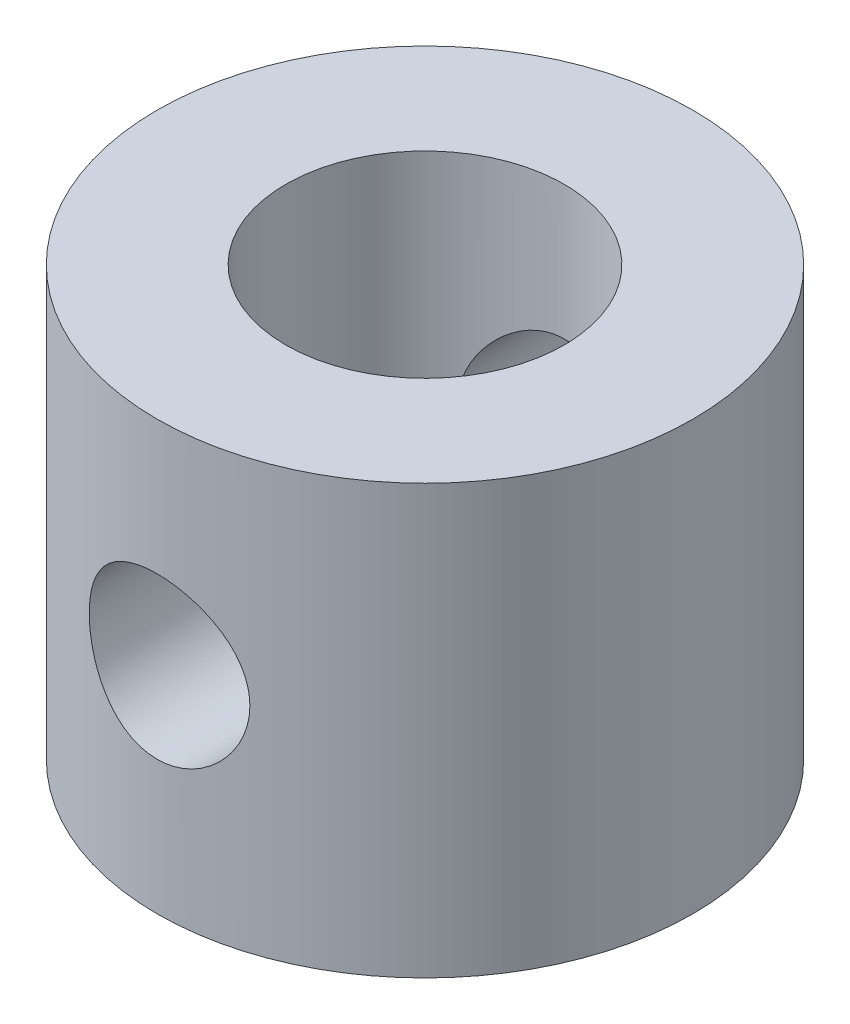
ISO-10303-21;
HEADER;
FILE_DESCRIPTION(('STEP AP214'),'2;1');
FILE_NAME('part.step','',(''),(''),'','','');
FILE_SCHEMA(('AUTOMOTIVE_DESIGN { 1 0 10303 214 1 1 1 1 }'));
ENDSEC;
DATA;
#1=APPLICATION_CONTEXT('core data for automotive mechanical design processes');
#2=APPLICATION_PROTOCOL_DEFINITION('international standard','automotive_design',2000,#1);
#3=PRODUCT_CONTEXT('',#1,'mechanical');
#4=PRODUCT('Part','Part','',(#3));
#5=PRODUCT_RELATED_PRODUCT_CATEGORY('part','',(#4));
#6=PRODUCT_DEFINITION_FORMATION('','',#4);
#7=PRODUCT_DEFINITION_CONTEXT('part definition',#1,'design');
#8=PRODUCT_DEFINITION('design','',#6,#7);
#9=PRODUCT_DEFINITION_SHAPE('','',#8);
#10=(LENGTH_UNIT() NAMED_UNIT(*) SI_UNIT(.MILLI.,.METRE.));
#11=(NAMED_UNIT(*) PLANE_ANGLE_UNIT() SI_UNIT($,.RADIAN.));
#12=(NAMED_UNIT(*) SI_UNIT($,.STERADIAN.) SOLID_ANGLE_UNIT());
#13=UNCERTAINTY_MEASURE_WITH_UNIT(LENGTH_MEASURE(1.E-05),#10,'distance_accuracy_value','');
#14=(GEOMETRIC_REPRESENTATION_CONTEXT(3) GLOBAL_UNCERTAINTY_ASSIGNED_CONTEXT((#13)) GLOBAL_UNIT_ASSIGNED_CONTEXT((#10,
#11,#12)) REPRESENTATION_CONTEXT('',''));
#15=CARTESIAN_POINT('',(0.,0.,0.));
#16=DIRECTION('',(0.,0.,1.));
#17=DIRECTION('',(1.,0.,0.));
#18=AXIS2_PLACEMENT_3D('',#15,#16,#17);
#19=CARTESIAN_POINT('',(0.,8.,0.));
#20=DIRECTION('',(0.,-1.,0.));
#21=DIRECTION('',(0.,0.,-1.));
#22=AXIS2_PLACEMENT_3D('',#19,#20,#21);
#23=CYLINDRICAL_SURFACE('',#22,5.);
#24=CARTESIAN_POINT('',(0.,5.5,-5.));
#25=CARTESIAN_POINT('',(-0.0822886127532999,5.49999900251511,-4.9999992925055));
#26=CARTESIAN_POINT('',(-0.164587318351529,5.49320613637603,-4.99794915693954));
#27=CARTESIAN_POINT('',(-0.326788125304881,5.4662786457779,-4.98997105593691));
#28=CARTESIAN_POINT('',(-0.40668950441142,5.44614004197666,-4.98404193389692));
#29=CARTESIAN_POINT('',(-0.561732707754526,5.39325398308974,-4.96895552501836));
#30=CARTESIAN_POINT('',(-0.636881364395373,5.36052513038106,-4.95980300250425));
#31=CARTESIAN_POINT('',(-0.780624181053131,5.28346390694416,-4.93922109237645));
#32=CARTESIAN_POINT('',(-0.849217467469669,5.23912999260458,-4.92779140192067));
#33=CARTESIAN_POINT('',(-0.979871797183745,5.13877599252733,-4.90350737192774));
#34=CARTESIAN_POINT('',(-1.04171807124434,5.08248337411409,-4.89062383657036));
#35=CARTESIAN_POINT('',(-1.15524920923324,4.96039077008982,-4.86505834210442));
#36=CARTESIAN_POINT('',(-1.20693236327441,4.89458918787504,-4.85237641724501));
#37=CARTESIAN_POINT('',(-1.29980037723708,4.75352924696239,-4.82834113993772));
#38=CARTESIAN_POINT('',(-1.34072309022213,4.67809153900926,-4.81702406663875));
#39=CARTESIAN_POINT('',(-1.4092139477476,4.52101074576971,-4.79743620394031));
#40=CARTESIAN_POINT('',(-1.43678529919973,4.43936915607202,-4.78916468313311));
#41=CARTESIAN_POINT('',(-1.47701633682652,4.27460973386954,-4.77690870838434));
#42=CARTESIAN_POINT('',(-1.49007196234677,4.19159725613606,-4.77281069324533));
#43=CARTESIAN_POINT('',(-1.50213730614672,4.02446684378323,-4.76902789749767));
#44=CARTESIAN_POINT('',(-1.50115042761078,3.94034918194091,-4.76934204760571));
#45=CARTESIAN_POINT('',(-1.48546977199812,3.77661609139152,-4.77424744067778));
#46=CARTESIAN_POINT('',(-1.47127205262685,3.69694774963776,-4.7786838859914));
#47=CARTESIAN_POINT('',(-1.43037420427056,3.54118021372654,-4.79108356228624));
#48=CARTESIAN_POINT('',(-1.40367284141641,3.46508137262567,-4.79904714132351));
#49=CARTESIAN_POINT('',(-1.33816026653682,3.31739965033926,-4.81772733074973));
#50=CARTESIAN_POINT('',(-1.29918816934643,3.24589291604474,-4.82848016115952));
#51=CARTESIAN_POINT('',(-1.21035222588683,3.11026797798981,-4.85150987000065));
#52=CARTESIAN_POINT('',(-1.16048574002588,3.04615157058622,-4.86378711746991));
#53=CARTESIAN_POINT('',(-1.04881290765546,2.92431380923798,-4.88911011297937));
#54=CARTESIAN_POINT('',(-0.986594907466972,2.86697133597033,-4.90216654310498));
#55=CARTESIAN_POINT('',(-0.853263259313967,2.76344601593575,-4.92712244063259));
#56=CARTESIAN_POINT('',(-0.782149051860888,2.71726387158557,-4.9390218351841));
#57=CARTESIAN_POINT('',(-0.632355038342803,2.63714007753527,-4.9604316006947));
#58=CARTESIAN_POINT('',(-0.553627749747951,2.60328248375014,-4.96992543668314));
#59=CARTESIAN_POINT('',(-0.39124541560352,2.54940040990037,-4.98533521832222));
#60=CARTESIAN_POINT('',(-0.307591751589582,2.52937207146751,-4.99125216186999));
#61=CARTESIAN_POINT('',(-0.140952242668332,2.50434782210061,-4.99868364643538));
#62=CARTESIAN_POINT('',(-0.0580500976011871,2.49883841419839,-5.0003485041779));
#63=CARTESIAN_POINT('',(0.107499605823383,2.50156915571208,-4.9995292324176));
#64=CARTESIAN_POINT('',(0.19014719669078,2.50980746965144,-4.99704565677756));
#65=CARTESIAN_POINT('',(0.350903605309697,2.5393846111115,-4.98830696987163));
#66=CARTESIAN_POINT('',(0.429072772614169,2.56042338758087,-4.98213829799417));
#67=CARTESIAN_POINT('',(0.580754638954522,2.6146432327782,-4.96674347841533));
#68=CARTESIAN_POINT('',(0.654266777025583,2.64782576103786,-4.95751696321085));
#69=CARTESIAN_POINT('',(0.796437189461052,2.72625316548113,-4.93669654351325));
#70=CARTESIAN_POINT('',(0.86494382619967,2.77175934094797,-4.92505280829675));
#71=CARTESIAN_POINT('',(0.993523307980147,2.87322475405281,-4.90073468764318));
#72=CARTESIAN_POINT('',(1.05359403235593,2.92918661188767,-4.8880600443108));
#73=CARTESIAN_POINT('',(1.16585744551027,3.05238730836935,-4.86253171869138));
#74=CARTESIAN_POINT('',(1.21768481231503,3.11996187577174,-4.84968825033268));
#75=CARTESIAN_POINT('',(1.30928995072154,3.26312793901353,-4.82576515238464));
#76=CARTESIAN_POINT('',(1.34906803829472,3.33871922455821,-4.81468547654651));
#77=CARTESIAN_POINT('',(1.41517347127168,3.49553249125469,-4.79567189615055));
#78=CARTESIAN_POINT('',(1.4415634693705,3.57672618653659,-4.78772337843827));
#79=CARTESIAN_POINT('',(1.48021730815114,3.74268796893148,-4.77591594362794));
#80=CARTESIAN_POINT('',(1.49248598978779,3.82745482078767,-4.772055625083));
#81=CARTESIAN_POINT('',(1.50221984485059,3.99436151837623,-4.76899972496087));
#82=CARTESIAN_POINT('',(1.5002805530849,4.07646365101759,-4.76961647442754));
#83=CARTESIAN_POINT('',(1.48307505444813,4.2391141033728,-4.77499401288294));
#84=CARTESIAN_POINT('',(1.46780938124716,4.31966248517635,-4.77975463592551));
#85=CARTESIAN_POINT('',(1.42476888804136,4.47594539914285,-4.79275763670386));
#86=CARTESIAN_POINT('',(1.39715175507068,4.55172728736169,-4.80095604545965));
#87=CARTESIAN_POINT('',(1.33031507121129,4.69764243881772,-4.81990278909136));
#88=CARTESIAN_POINT('',(1.29109329962876,4.76777461764076,-4.83065161194312));
#89=CARTESIAN_POINT('',(1.20048763805072,4.90316311652711,-4.85397676425833));
#90=CARTESIAN_POINT('',(1.14871276092994,4.96814876126041,-4.86660540163798));
#91=CARTESIAN_POINT('',(1.03517434629782,5.08870249830786,-4.89201320450026));
#92=CARTESIAN_POINT('',(0.973408217134501,5.14426813946776,-4.90479240823905));
#93=CARTESIAN_POINT('',(0.839465762183249,5.24602341229503,-4.92950936570649));
#94=CARTESIAN_POINT('',(0.767037885790608,5.29189144685549,-4.94141159765674));
#95=CARTESIAN_POINT('',(0.61514137398353,5.37073516990402,-4.96260680455813));
#96=CARTESIAN_POINT('',(0.535676052998956,5.40371688827451,-4.97190099931067));
#97=CARTESIAN_POINT('',(0.380757712655282,5.45289527565275,-4.98602174969301));
#98=CARTESIAN_POINT('',(0.305786961954235,5.47051167288325,-4.99122027381068));
#99=CARTESIAN_POINT('',(0.15388019523078,5.49406352524158,-4.99820944494492));
#100=CARTESIAN_POINT('',(0.0769445098581397,5.50000093270482,-5.0000006615474));
#101=CARTESIAN_POINT('',(0.,5.5,-5.));
#102=B_SPLINE_CURVE_WITH_KNOTS('',3,(#24,#25,#26,#27,#28,#29,#30,#31,#32,#33,#34,#35,#36,#37,
#38,#39,#40,#41,#42,#43,#44,#45,#46,#47,#48,#49,#50,#51,#52,#53,#54,#55,#56,#57,#58,#59,#60,#61,
#62,#63,#64,#65,#66,#67,#68,#69,#70,#71,#72,#73,#74,#75,#76,#77,#78,#79,#80,#81,#82,#83,#84,#85,
#86,#87,#88,#89,#90,#91,#92,#93,#94,#95,#96,#97,#98,#99,#100,#101),.UNSPECIFIED.,.T.,.F.,(4,2,2,
2,2,2,2,2,2,2,2,2,2,2,2,2,2,2,2,2,2,2,2,2,2,2,2,2,2,2,2,2,2,2,2,2,2,2,4),(0.,0.24658320361261,
0.493239964846,0.739533676300874,0.985860164412702,1.23855602948191,1.49129437288633,
1.74971481004109,2.00807314543224,2.25919689356599,2.51025978319089,2.75226016697676,
2.99428443658001,3.23962426447119,3.48502360158555,3.74067104048167,3.99633456531071,
4.25371046881689,4.51101453528808,4.75908809438545,5.00712853550327,5.24956746682327,
5.49203554593728,5.74011305702908,5.98825282000191,6.24540400322818,6.5025484425268,
6.75847814951252,7.01432009460283,7.25950155466943,7.504673196616,7.74680040402721,
7.98897397553107,8.23996925679931,8.49102974897502,8.74942996156671,9.00770911595235,
9.23831691930459,9.46888616948874),.UNSPECIFIED.);
#103=CARTESIAN_POINT('',(0.,5.5,-5.));
#104=VERTEX_POINT('',#103);
#105=EDGE_CURVE('E62',#104,#104,#102,.T.);
#106=ORIENTED_EDGE('',*,*,#105,.T.);
#107=EDGE_LOOP('',(#106));
#108=FACE_BOUND('',#107,.T.);
#109=CARTESIAN_POINT('',(1.5,4.,4.76969600708473));
#110=CARTESIAN_POINT('',(1.49999897633764,3.9178054520576,4.7696968572698));
#111=CARTESIAN_POINT('',(1.49322108167142,3.83560077585598,4.77184390209069));
#112=CARTESIAN_POINT('',(1.46635844446749,3.67359475040806,4.780165783029));
#113=CARTESIAN_POINT('',(1.44626925573578,3.59379421349853,4.78634196493468));
#114=CARTESIAN_POINT('',(1.39352753269955,3.43896527172827,4.80196102485633));
#115=CARTESIAN_POINT('',(1.36089589394243,3.36392917036691,4.81139846703232));
#116=CARTESIAN_POINT('',(1.28406421917929,3.2203780660047,4.83246932547567));
#117=CARTESIAN_POINT('',(1.23986245137053,3.15186404131556,4.84410307041019));
#118=CARTESIAN_POINT('',(1.13964754141627,3.02113360942262,4.86866862185765));
#119=CARTESIAN_POINT('',(1.08333207175807,2.95915410205371,4.88162808311636));
#120=CARTESIAN_POINT('',(0.961136237579599,2.84536204867749,4.90714861936757));
#121=CARTESIAN_POINT('',(0.895254645461112,2.79355080955012,4.91970964297705));
#122=CARTESIAN_POINT('',(0.75411143779369,2.70053730016669,4.94333214579389));
#123=CARTESIAN_POINT('',(0.678684021335815,2.65957657555719,4.95435724342404));
#124=CARTESIAN_POINT('',(0.521624645369354,2.59101274095724,4.97334435920684));
#125=CARTESIAN_POINT('',(0.439994028387912,2.56340675014255,4.98130703789495));
#126=CARTESIAN_POINT('',(0.275323852630829,2.52311999890949,4.99307646003589));
#127=CARTESIAN_POINT('',(0.192391398953801,2.5100348723473,4.99699557369338));
#128=CARTESIAN_POINT('',(0.0254218237493146,2.49788267535356,5.00063201501348));
#129=CARTESIAN_POINT('',(-0.0586150620503687,2.49881266059804,5.00035022521079));
#130=CARTESIAN_POINT('',(-0.222571156600161,2.51439286854302,4.99569603817659));
#131=CARTESIAN_POINT('',(-0.302536267641342,2.52860519380987,4.9914542020526));
#132=CARTESIAN_POINT('',(-0.458889213442527,2.56963133599429,4.97951522112593));
#133=CARTESIAN_POINT('',(-0.535276821322846,2.59644595094267,4.97181785750586));
#134=CARTESIAN_POINT('',(-0.683347326351281,2.66221202341856,4.95365220986963));
#135=CARTESIAN_POINT('',(-0.754965064694478,2.70130120280727,4.94315269676706));
#136=CARTESIAN_POINT('',(-0.890764673783156,2.79039785242823,4.92049640648069));
#137=CARTESIAN_POINT('',(-0.954944774872131,2.84040791296348,4.90833923637778));
#138=CARTESIAN_POINT('',(-1.0766604815298,2.9521977507516,4.88311550488165));
#139=CARTESIAN_POINT('',(-1.13384458040112,3.01435691902974,4.87003195321461));
#140=CARTESIAN_POINT('',(-1.23707651539824,3.14751001789005,4.84483979887497));
#141=CARTESIAN_POINT('',(-1.28312324482853,3.21850482538923,4.8327312931702));
#142=CARTESIAN_POINT('',(-1.3631399533545,3.36823946924899,4.81077903197678));
#143=CARTESIAN_POINT('',(-1.39698989237679,3.44704704586292,4.80095810695957));
#144=CARTESIAN_POINT('',(-1.45083362878413,3.60960720844554,4.78496392548436));
#145=CARTESIAN_POINT('',(-1.4708319464056,3.69335817153456,4.7787894791583));
#146=CARTESIAN_POINT('',(-1.49574770282165,3.86008236073928,4.77104849541241));
#147=CARTESIAN_POINT('',(-1.50119946380212,3.94296822389398,4.7693187867044));
#148=CARTESIAN_POINT('',(-1.49835947233062,4.10847290000987,4.77021192441924));
#149=CARTESIAN_POINT('',(-1.4900696437133,4.19109174873085,4.77283416156589));
#150=CARTESIAN_POINT('',(-1.4604576357419,4.35148837797087,4.78197558554912));
#151=CARTESIAN_POINT('',(-1.4394796143128,4.42933616426352,4.78839176507489));
#152=CARTESIAN_POINT('',(-1.3854857774794,4.58040169081492,4.80429141231227));
#153=CARTESIAN_POINT('',(-1.35246810342759,4.65361871414057,4.81377535359073));
#154=CARTESIAN_POINT('',(-1.274318711965,4.79551746407213,4.83505835023047));
#155=CARTESIAN_POINT('',(-1.22888564172729,4.86402472098579,4.84691271069799));
#156=CARTESIAN_POINT('',(-1.12755301600385,4.9926381061808,4.87148205646987));
#157=CARTESIAN_POINT('',(-1.07165095534897,5.05274221761279,4.88419724730003));
#158=CARTESIAN_POINT('',(-0.948455132493598,5.16518040581474,4.90963633548158));
#159=CARTESIAN_POINT('',(-0.880811065857433,5.21713562898698,4.92234245063004));
#160=CARTESIAN_POINT('',(-0.737461784590248,5.30896670102775,4.94584851748651));
#161=CARTESIAN_POINT('',(-0.661756970543943,5.34884314978146,4.95664856384717));
#162=CARTESIAN_POINT('',(-0.504935504705221,5.4150000305683,4.97505970474957));
#163=CARTESIAN_POINT('',(-0.423864622037839,5.44138201615898,4.98269453424966));
#164=CARTESIAN_POINT('',(-0.258169966504588,5.48006091889042,4.99401979596827));
#165=CARTESIAN_POINT('',(-0.173547217354762,5.49236186594842,4.9977113567088));
#166=CARTESIAN_POINT('',(-0.0066521538827426,5.5022230440545,5.00066544081399));
#167=CARTESIAN_POINT('',(0.0755851790862068,5.50033269540783,5.00009305111322));
#168=CARTESIAN_POINT('',(0.238519481164404,5.48317836750088,4.99497264465037));
#169=CARTESIAN_POINT('',(0.319216537346529,5.46791514651956,4.99042485330462));
#170=CARTESIAN_POINT('',(0.475935813041358,5.42478833860037,4.97791168358327));
#171=CARTESIAN_POINT('',(0.551998927351392,5.39706181935099,4.96998352900866));
#172=CARTESIAN_POINT('',(0.698433237752053,5.32991808549281,4.9515294303945));
#173=CARTESIAN_POINT('',(0.76880349605058,5.29049894971381,4.94100305949946));
#174=CARTESIAN_POINT('',(0.904301892420563,5.19962654256997,4.91803965828228));
#175=CARTESIAN_POINT('',(0.969190250076766,5.14782856999923,4.90555226923559));
#176=CARTESIAN_POINT('',(1.08953757134594,5.0342896116672,4.88023537212334));
#177=CARTESIAN_POINT('',(1.14499380960193,4.97254576210185,4.86740576641079));
#178=CARTESIAN_POINT('',(1.24656269394549,4.83865922168949,4.84240680631319));
#179=CARTESIAN_POINT('',(1.29234759757956,4.76626144660956,4.83026852693485));
#180=CARTESIAN_POINT('',(1.37104313528776,4.61444482583898,4.80852547508793));
#181=CARTESIAN_POINT('',(1.40395995557289,4.5350293763988,4.79891948596955));
#182=CARTESIAN_POINT('',(1.4530194253295,4.38025956839373,4.78427816717595));
#183=CARTESIAN_POINT('',(1.47058859011232,4.30539135306901,4.7788615484052));
#184=CARTESIAN_POINT('',(1.49407818835144,4.15368477750423,4.77157042597167));
#185=CARTESIAN_POINT('',(1.50000095706095,4.07684681535475,4.7696952122143));
#186=CARTESIAN_POINT('',(1.5,4.,4.76969600708473));
#187=B_SPLINE_CURVE_WITH_KNOTS('',3,(#109,#110,#111,#112,#113,#114,#115,#116,#117,#118,#119,
#120,#121,#122,#123,#124,#125,#126,#127,#128,#129,#130,#131,#132,#133,#134,#135,#136,#137,#138,
#139,#140,#141,#142,#143,#144,#145,#146,#147,#148,#149,#150,#151,#152,#153,#154,#155,#156,#157,
#158,#159,#160,#161,#162,#163,#164,#165,#166,#167,#168,#169,#170,#171,#172,#173,#174,#175,#176,
#177,#178,#179,#180,#181,#182,#183,#184,#185,#186),.UNSPECIFIED.,.T.,.F.,(4,2,2,2,2,2,2,2,2,2,2,
2,2,2,2,2,2,2,2,2,2,2,2,2,2,2,2,2,2,2,2,2,2,2,2,2,2,2,4),(0.,0.246300165915542,0.492682641689,
0.738656414466193,0.984667025370101,1.23773150007984,1.49082847871273,1.74915939273645,
2.00743455587877,2.25832140149558,2.5091555410144,2.7520012599088,2.99486235890376,
3.24055209335676,3.4863001659083,3.74152147023278,3.99676812491863,4.25446238246266,
4.51207250628411,4.76008080790309,5.00805439107388,5.24958594938817,5.49115481045787,
5.73920731809388,5.98731925928923,6.24479506100602,6.50225807324202,6.75775391814325,
7.01317662321682,7.2587630391122,7.50433553047754,7.74727096872219,7.99024634491378,
8.24099627054488,8.4918185262989,8.75011639669147,9.00828993963944,9.23861153857448,
9.4688869503356),.UNSPECIFIED.);
#188=CARTESIAN_POINT('',(1.5,4.,4.76969600708473));
#189=VERTEX_POINT('',#188);
#190=EDGE_CURVE('E80',#189,#189,#187,.T.);
#191=ORIENTED_EDGE('',*,*,#190,.T.);
#192=EDGE_LOOP('',(#191));
#193=FACE_BOUND('',#192,.T.);
#194=CARTESIAN_POINT('',(0.,8.,0.));
#195=DIRECTION('',(0.,1.,0.));
#196=DIRECTION('',(0.,0.,1.));
#197=AXIS2_PLACEMENT_3D('',#194,#195,#196);
#198=CIRCLE('',#197,5.);
#199=CARTESIAN_POINT('',(0.,8.,5.));
#200=VERTEX_POINT('',#199);
#201=EDGE_CURVE('E10',#200,#200,#198,.T.);
#202=ORIENTED_EDGE('',*,*,#201,.F.);
#203=EDGE_LOOP('',(#202));
#204=FACE_BOUND('',#203,.T.);
#205=CARTESIAN_POINT('',(0.,0.,0.));
#206=DIRECTION('',(0.,1.,0.));
#207=DIRECTION('',(0.,0.,1.));
#208=AXIS2_PLACEMENT_3D('',#205,#206,#207);
#209=CIRCLE('',#208,5.);
#210=CARTESIAN_POINT('',(0.,0.,5.));
#211=VERTEX_POINT('',#210);
#212=EDGE_CURVE('E49',#211,#211,#209,.T.);
#213=ORIENTED_EDGE('',*,*,#212,.T.);
#214=EDGE_LOOP('',(#213));
#215=FACE_BOUND('',#214,.T.);
#216=ADVANCED_FACE('F40',(#108,#193,#204,#215),#23,.T.);
#217=CARTESIAN_POINT('',(0.,8.,0.));
#218=DIRECTION('',(0.,1.,0.));
#219=DIRECTION('',(0.,0.,1.));
#220=AXIS2_PLACEMENT_3D('',#217,#218,#219);
#221=PLANE('',#220);
#222=CARTESIAN_POINT('',(0.,8.,0.));
#223=DIRECTION('',(0.,1.,0.));
#224=DIRECTION('',(0.,0.,1.));
#225=AXIS2_PLACEMENT_3D('',#222,#223,#224);
#226=CIRCLE('',#225,2.6);
#227=CARTESIAN_POINT('',(0.,8.,2.6));
#228=VERTEX_POINT('',#227);
#229=EDGE_CURVE('E54',#228,#228,#226,.T.);
#230=ORIENTED_EDGE('',*,*,#229,.F.);
#231=EDGE_LOOP('',(#230));
#232=FACE_BOUND('',#231,.T.);
#233=ORIENTED_EDGE('',*,*,#201,.T.);
#234=EDGE_LOOP('',(#233));
#235=FACE_BOUND('',#234,.T.);
#236=ADVANCED_FACE('F94',(#232,#235),#221,.T.);
#237=CARTESIAN_POINT('',(0.,0.,0.));
#238=DIRECTION('',(0.,1.,0.));
#239=DIRECTION('',(0.,0.,1.));
#240=AXIS2_PLACEMENT_3D('',#237,#238,#239);
#241=PLANE('',#240);
#242=CARTESIAN_POINT('',(0.,0.,0.));
#243=DIRECTION('',(0.,1.,0.));
#244=DIRECTION('',(0.,0.,1.));
#245=AXIS2_PLACEMENT_3D('',#242,#243,#244);
#246=CIRCLE('',#245,2.6);
#247=CARTESIAN_POINT('',(0.,0.,2.6));
#248=VERTEX_POINT('',#247);
#249=EDGE_CURVE('E58',#248,#248,#246,.T.);
#250=ORIENTED_EDGE('',*,*,#249,.T.);
#251=EDGE_LOOP('',(#250));
#252=FACE_BOUND('',#251,.T.);
#253=ORIENTED_EDGE('',*,*,#212,.F.);
#254=EDGE_LOOP('',(#253));
#255=FACE_BOUND('',#254,.T.);
#256=ADVANCED_FACE('F99',(#252,#255),#241,.F.);
#257=CARTESIAN_POINT('',(0.,-20.,0.));
#258=DIRECTION('',(0.,1.,0.));
#259=DIRECTION('',(0.,0.,1.));
#260=AXIS2_PLACEMENT_3D('',#257,#258,#259);
#261=CYLINDRICAL_SURFACE('',#260,2.6);
#262=CARTESIAN_POINT('',(0.,2.5,2.6));
#263=CARTESIAN_POINT('',(0.0772319233472709,2.50000422584076,2.59999618902905));
#264=CARTESIAN_POINT('',(0.154588503811869,2.50600568200707,2.59652102324302));
#265=CARTESIAN_POINT('',(0.30698942305146,2.52971600244192,2.58295249734723));
#266=CARTESIAN_POINT('',(0.382027613052044,2.54745359821324,2.57284289582588));
#267=CARTESIAN_POINT('',(0.527274528120949,2.59367079231767,2.5470369592744));
#268=CARTESIAN_POINT('',(0.597504377950372,2.62209928948115,2.53136722080655));
#269=CARTESIAN_POINT('',(0.732004448603878,2.68858736378931,2.49579960321753));
#270=CARTESIAN_POINT('',(0.796276126717773,2.72664457734014,2.47590276192954));
#271=CARTESIAN_POINT('',(0.922347169418258,2.81441998624762,2.43188247991948));
#272=CARTESIAN_POINT('',(0.983622752735075,2.86478703726559,2.40755643880259));
#273=CARTESIAN_POINT('',(1.09736665119166,2.97431427944483,2.35789035294577));
#274=CARTESIAN_POINT('',(1.1498243480984,3.03348491233794,2.33254913056444));
#275=CARTESIAN_POINT('',(1.25034812806608,3.16672344682317,2.28038993113865));
#276=CARTESIAN_POINT('',(1.29727564936818,3.24171642110437,2.25372149637089));
#277=CARTESIAN_POINT('',(1.37766229380929,3.40008363699771,2.20550567430935));
#278=CARTESIAN_POINT('',(1.41114209513433,3.48344476248284,2.1839504456412));
#279=CARTESIAN_POINT('',(1.45709106717089,3.63698101240817,2.15347804278974));
#280=CARTESIAN_POINT('',(1.47259345908259,3.70589978106961,2.14280817202664));
#281=CARTESIAN_POINT('',(1.49373709144844,3.84590038492968,2.1281265088906));
#282=CARTESIAN_POINT('',(1.49938921224343,3.91697974515273,2.12410737054817));
#283=CARTESIAN_POINT('',(1.50051751778596,4.05936387203622,2.12331062302603));
#284=CARTESIAN_POINT('',(1.49597875410823,4.13066881641224,2.12654365162835));
#285=CARTESIAN_POINT('',(1.47696815985605,4.27130961117354,2.13978810271173));
#286=CARTESIAN_POINT('',(1.46248936926787,4.34064404635882,2.14980427468783));
#287=CARTESIAN_POINT('',(1.42442910356457,4.47526147126032,2.17520460689886));
#288=CARTESIAN_POINT('',(1.40089748277065,4.54056441594903,2.19055932372721));
#289=CARTESIAN_POINT('',(1.34555715201737,4.66649272583982,2.22497993462807));
#290=CARTESIAN_POINT('',(1.31374529923549,4.7271163036016,2.24404723714576));
#291=CARTESIAN_POINT('',(1.23675403933777,4.85246470844864,2.28750836842498));
#292=CARTESIAN_POINT('',(1.19024063300664,4.91624577708135,2.31226373338703));
#293=CARTESIAN_POINT('',(1.08788149023454,5.03571723541576,2.36215169589699));
#294=CARTESIAN_POINT('',(1.03202760160122,5.09140047742063,2.3872846053646));
#295=CARTESIAN_POINT('',(0.904654430224473,5.19974528144135,2.43861635906864));
#296=CARTESIAN_POINT('',(0.8320631449459,5.25126707271633,2.46458865921183));
#297=CARTESIAN_POINT('',(0.67765480278136,5.34117419696362,2.51142899926663));
#298=CARTESIAN_POINT('',(0.595843476550903,5.37956763056046,2.53230018445625));
#299=CARTESIAN_POINT('',(0.431033354631573,5.43921984692024,2.5653031380198));
#300=CARTESIAN_POINT('',(0.348496751035148,5.46146929319186,2.57793418331031));
#301=CARTESIAN_POINT('',(0.180050699830186,5.49160328139947,2.59513431083256));
#302=CARTESIAN_POINT('',(0.0941447995423771,5.49950253789542,2.59971165111168));
#303=CARTESIAN_POINT('',(-0.0670587610617387,5.50039357082806,2.60022824408441));
#304=CARTESIAN_POINT('',(-0.142350461706043,5.49511301154378,2.5971685836405));
#305=CARTESIAN_POINT('',(-0.290777687970471,5.47345566815016,2.584761559295));
#306=CARTESIAN_POINT('',(-0.363913189761351,5.4570787614574,2.57541412593122));
#307=CARTESIAN_POINT('',(-0.505183956093655,5.41427473299264,2.55144366257697));
#308=CARTESIAN_POINT('',(-0.573371031770445,5.38797823752474,2.53688932316724));
#309=CARTESIAN_POINT('',(-0.70439992093384,5.32629908705556,2.50367625973366));
#310=CARTESIAN_POINT('',(-0.767240490984963,5.29091432604676,2.48501658453161));
#311=CARTESIAN_POINT('',(-0.892853212354957,5.20791436967487,2.44287665680085));
#312=CARTESIAN_POINT('',(-0.954935346336203,5.15940874132321,2.41909665858523));
#313=CARTESIAN_POINT('',(-1.07056081594621,5.0535904261804,2.37020029616982));
#314=CARTESIAN_POINT('',(-1.12409414720404,4.99626757262255,2.34508241144859));
#315=CARTESIAN_POINT('',(-1.22740027570858,4.8666752535838,2.29286031520664));
#316=CARTESIAN_POINT('',(-1.27602885116949,4.79344461127621,2.26586075280262));
#317=CARTESIAN_POINT('',(-1.36019777587724,4.63844547800455,2.21636069970409));
#318=CARTESIAN_POINT('',(-1.39575498759781,4.55668816284418,2.19385442977699));
#319=CARTESIAN_POINT('',(-1.44607172873574,4.40476407350995,2.1609212142528));
#320=CARTESIAN_POINT('',(-1.46365622152303,4.33587219599758,2.14893883535283));
#321=CARTESIAN_POINT('',(-1.48890635358012,4.19551680412308,2.13152541771848));
#322=CARTESIAN_POINT('',(-1.49658376243413,4.12405644508777,2.12608660576822));
#323=CARTESIAN_POINT('',(-1.50159649998081,3.9804190950802,2.12255024905296));
#324=CARTESIAN_POINT('',(-1.49890792610324,3.90824083107356,2.12446967133412));
#325=CARTESIAN_POINT('',(-1.4833020401426,3.76553267601252,2.13539226423788));
#326=CARTESIAN_POINT('',(-1.47037833725534,3.69500384319765,2.14439986068681));
#327=CARTESIAN_POINT('',(-1.4353985039461,3.55903151797086,2.16796162220021));
#328=CARTESIAN_POINT('',(-1.41355658787739,3.49350888297196,2.18238508618141));
#329=CARTESIAN_POINT('',(-1.36157893194971,3.36691977189744,2.21518502116046));
#330=CARTESIAN_POINT('',(-1.33144018684938,3.30585492066022,2.23356292399025));
#331=CARTESIAN_POINT('',(-1.25835059753977,3.17984883412412,2.27565198451024));
#332=CARTESIAN_POINT('',(-1.21413943897579,3.11576746477551,2.29974841870992));
#333=CARTESIAN_POINT('',(-1.11651884112707,2.99530903450999,2.34869562126845));
#334=CARTESIAN_POINT('',(-1.06310115196226,2.93893896558392,2.37354704957429));
#335=CARTESIAN_POINT('',(-0.940231850179857,2.82795533351852,2.42506981295375));
#336=CARTESIAN_POINT('',(-0.869594857131723,2.77455284332916,2.45154921266989));
#337=CARTESIAN_POINT('',(-0.71884643093712,2.68048069373367,2.49990050424106));
#338=CARTESIAN_POINT('',(-0.63874037484924,2.63980385540121,2.52177499158025));
#339=CARTESIAN_POINT('',(-0.486117575674212,2.57901839713299,2.55512590391003));
#340=CARTESIAN_POINT('',(-0.41479465204405,2.55653551527546,2.56776093747192));
#341=CARTESIAN_POINT('',(-0.268935397058581,2.52241786205481,2.58709244556583));
#342=CARTESIAN_POINT('',(-0.194408720116058,2.51075260246432,2.59380560759043));
#343=CARTESIAN_POINT('',(-0.0995437111432775,2.50317322496479,2.59817058198816));
#344=CARTESIAN_POINT('',(-0.0796631835745615,2.50198451710654,2.59885550192346));
#345=CARTESIAN_POINT('',(-0.0398578754501862,2.50039730899632,2.59977073165908));
#346=CARTESIAN_POINT('',(-0.0199330895843243,2.49999890933621,2.60000098358842));
#347=CARTESIAN_POINT('',(0.,2.5,2.6));
#348=B_SPLINE_CURVE_WITH_KNOTS('',3,(#262,#263,#264,#265,#266,#267,#268,#269,#270,#271,#272,
#273,#274,#275,#276,#277,#278,#279,#280,#281,#282,#283,#284,#285,#286,#287,#288,#289,#290,#291,
#292,#293,#294,#295,#296,#297,#298,#299,#300,#301,#302,#303,#304,#305,#306,#307,#308,#309,#310,
#311,#312,#313,#314,#315,#316,#317,#318,#319,#320,#321,#322,#323,#324,#325,#326,#327,#328,#329,
#330,#331,#332,#333,#334,#335,#336,#337,#338,#339,#340,#341,#342,#343,#344,#345,#346,#347),
.UNSPECIFIED.,.T.,.F.,(4,2,2,2,2,2,2,2,2,2,2,2,2,2,2,2,2,2,2,2,2,2,2,2,2,2,2,2,2,2,2,2,2,2,2,2,
2,2,2,2,2,2,4),(0.,0.231611846858855,0.463792816206351,0.69487781152054,0.925906136556523,
1.17381508553235,1.42202045306,1.69785023538302,1.97325424310944,2.18665784531557,
2.39982557796629,2.6133061984075,2.82693645078876,3.03940669462488,3.2519577009908,
3.49917560623819,3.74661041548782,4.02336294890597,4.29994440753833,4.55764772583679,
4.81508664791729,5.0405912993435,5.26609844200207,5.48873416474255,5.71142152508112,
5.9573228497219,6.20350986812426,6.47806627680437,6.75226724566818,6.96765919266708,
7.18279501842703,7.39842721499104,7.61419415833435,7.82505766900029,8.0359976584558,
8.27954382656283,8.52330937954971,8.79920833004369,9.07495135573467,9.30152478429026,
9.52745768341078,9.58722768495499,9.64700529364498),.UNSPECIFIED.);
#349=CARTESIAN_POINT('',(0.,2.5,2.6));
#350=VERTEX_POINT('',#349);
#351=EDGE_CURVE('E41',#350,#350,#348,.T.);
#352=ORIENTED_EDGE('',*,*,#351,.T.);
#353=EDGE_LOOP('',(#352));
#354=FACE_BOUND('',#353,.T.);
#355=CARTESIAN_POINT('',(1.5,4.,-2.12367605815953));
#356=CARTESIAN_POINT('',(1.49999928909873,3.92383777021202,-2.12367732010198));
#357=CARTESIAN_POINT('',(1.49416319943128,3.84767021210966,-2.12783497879457));
#358=CARTESIAN_POINT('',(1.4712117447442,3.69785045295872,-2.14376324889551));
#359=CARTESIAN_POINT('',(1.45408458370784,3.62420096732582,-2.15554182179209));
#360=CARTESIAN_POINT('',(1.40963799696196,3.48187894489869,-2.18486059394223));
#361=CARTESIAN_POINT('',(1.38238602948755,3.41317698266372,-2.20236256959965));
#362=CARTESIAN_POINT('',(1.31867721679055,3.28135094008057,-2.24108849396905));
#363=CARTESIAN_POINT('',(1.28221740924734,3.21822866365305,-2.26231363981651));
#364=CARTESIAN_POINT('',(1.19635715928324,3.09158375353205,-2.30897656645711));
#365=CARTESIAN_POINT('',(1.14596421323542,3.02880953910146,-2.33461985660883));
#366=CARTESIAN_POINT('',(1.03570981206248,2.91199196339106,-2.38558124715328));
#367=CARTESIAN_POINT('',(0.97584207159822,2.85795444626361,-2.41089911953179));
#368=CARTESIAN_POINT('',(0.84125966402705,2.75495487989756,-2.46128563521212));
#369=CARTESIAN_POINT('',(0.765667222763021,2.7069980355903,-2.4860904122246));
#370=CARTESIAN_POINT('',(0.605784390319978,2.62483395894895,-2.52979639956002));
#371=CARTESIAN_POINT('',(0.521501412024686,2.5906151282782,-2.54870258675667));
#372=CARTESIAN_POINT('',(0.354629136650126,2.54015806569076,-2.57696402775433));
#373=CARTESIAN_POINT('',(0.272566870909837,2.52258159129024,-2.58702424897548));
#374=CARTESIAN_POINT('',(0.106100690501687,2.50141254443148,-2.59917001209048));
#375=CARTESIAN_POINT('',(0.0216988270859588,2.49780808957919,-2.60126233019818));
#376=CARTESIAN_POINT('',(-0.136607932994459,2.50437834713234,-2.59747641211859));
#377=CARTESIAN_POINT('',(-0.210604602338938,2.51301733987497,-2.59248641573026));
#378=CARTESIAN_POINT('',(-0.355883792545236,2.54095297619946,-2.57656484138954));
#379=CARTESIAN_POINT('',(-0.427166113020732,2.56025040501419,-2.5656328256751));
#380=CARTESIAN_POINT('',(-0.56585545770048,2.60886481885539,-2.53867012485717));
#381=CARTESIAN_POINT('',(-0.633225205378961,2.63826402180718,-2.5225976787189));
#382=CARTESIAN_POINT('',(-0.762182204899402,2.70601796558082,-2.48667753467699));
#383=CARTESIAN_POINT('',(-0.823767782190764,2.74437528869282,-2.4668287485025));
#384=CARTESIAN_POINT('',(-0.946948510867343,2.83392450016347,-2.42240570497883));
#385=CARTESIAN_POINT('',(-1.00773978147128,2.88608237340914,-2.39755063533367));
#386=CARTESIAN_POINT('',(-1.12020857346445,2.99924606364086,-2.34711329727581));
#387=CARTESIAN_POINT('',(-1.17187461209173,3.06026285490992,-2.32153015901729));
#388=CARTESIAN_POINT('',(-1.26995614846561,3.19688593704133,-2.26949272251829));
#389=CARTESIAN_POINT('',(-1.31528747522395,3.27334700820536,-2.24321878996152));
#390=CARTESIAN_POINT('',(-1.392159774247,3.43447285637891,-2.19634530249607));
#391=CARTESIAN_POINT('',(-1.42372543413371,3.51912261160613,-2.17573561398002));
#392=CARTESIAN_POINT('',(-1.46579572293508,3.67396278577028,-2.14753990259684));
#393=CARTESIAN_POINT('',(-1.47949087515376,3.74293854798008,-2.13803987650995));
#394=CARTESIAN_POINT('',(-1.49705901885595,3.88269431807709,-2.12577891823736));
#395=CARTESIAN_POINT('',(-1.5009417889033,3.95347245867139,-2.12301127697307));
#396=CARTESIAN_POINT('',(-1.49866933768971,4.09482966187159,-2.12461548246257));
#397=CARTESIAN_POINT('',(-1.49250682579391,4.16540854261116,-2.12899251465939));
#398=CARTESIAN_POINT('',(-1.47048994966506,4.30432555167709,-2.14425567601924));
#399=CARTESIAN_POINT('',(-1.45462840098487,4.37266197935828,-2.15514663016219));
#400=CARTESIAN_POINT('',(-1.41375551288671,4.5061863131854,-2.18217669779433));
#401=CARTESIAN_POINT('',(-1.38865282254981,4.57133516273319,-2.19836802336967));
#402=CARTESIAN_POINT('',(-1.33016448982582,4.69674702184875,-2.2342420909138));
#403=CARTESIAN_POINT('',(-1.29677551673343,4.75700805378314,-2.25392623592668));
#404=CARTESIAN_POINT('',(-1.21613405486751,4.88171688618682,-2.29858249016957));
#405=CARTESIAN_POINT('',(-1.16749199915642,4.9451495304527,-2.3238859309454));
#406=CARTESIAN_POINT('',(-1.06075616664745,5.06355904000968,-2.3745084891531));
#407=CARTESIAN_POINT('',(-1.00265431412986,5.11852860176147,-2.39982760140228));
#408=CARTESIAN_POINT('',(-0.871260123942498,5.22422929257086,-2.45079018162417));
#409=CARTESIAN_POINT('',(-0.79701246238617,5.27390458382342,-2.47618705625137));
#410=CARTESIAN_POINT('',(-0.639554312053572,5.35977647684819,-2.52143997375939));
#411=CARTESIAN_POINT('',(-0.556350815332736,5.39598349664244,-2.54130029630008));
#412=CARTESIAN_POINT('',(-0.390309966772977,5.4507492002042,-2.57180865998144));
#413=CARTESIAN_POINT('',(-0.307978336873573,5.47049032120515,-2.58306774587589));
#414=CARTESIAN_POINT('',(-0.140497477622681,5.49579851763721,-2.5975566843405));
#415=CARTESIAN_POINT('',(-0.0553509376532899,5.50137874741534,-2.60079398844507));
#416=CARTESIAN_POINT('',(0.104338680774974,5.49823794828106,-2.59898472233435));
#417=CARTESIAN_POINT('',(0.178931432297278,5.49114826105064,-2.59488302030134));
#418=CARTESIAN_POINT('',(0.325656870659682,5.46611240459633,-2.58057740798517));
#419=CARTESIAN_POINT('',(0.397789444478426,5.44816573730706,-2.57037321774982));
#420=CARTESIAN_POINT('',(0.537664248058517,5.40225991241643,-2.54479309223234));
#421=CARTESIAN_POINT('',(0.605412686943564,5.37431529810259,-2.52942467094577));
#422=CARTESIAN_POINT('',(0.735332080371695,5.3094140980348,-2.49475720002296));
#423=CARTESIAN_POINT('',(0.797501563406389,5.27245514415516,-2.47545711773368));
#424=CARTESIAN_POINT('',(0.921838925050045,5.18598559252337,-2.43207944028664));
#425=CARTESIAN_POINT('',(0.983255216767375,5.1355417890794,-2.40770988244255));
#426=CARTESIAN_POINT('',(1.09724560309867,5.02582730438877,-2.35795023619029));
#427=CARTESIAN_POINT('',(1.14980902693823,4.96654613093709,-2.33255896126666));
#428=CARTESIAN_POINT('',(1.25040932414557,4.83318351444378,-2.28035609192218));
#429=CARTESIAN_POINT('',(1.29732744722405,4.75819306198903,-2.25369157531941));
#430=CARTESIAN_POINT('',(1.37769988814837,4.59983080688395,-2.20548197132038));
#431=CARTESIAN_POINT('',(1.41117384140497,4.51647145136626,-2.1839294367877));
#432=CARTESIAN_POINT('',(1.45766619930362,4.36107943944005,-2.153096589716));
#433=CARTESIAN_POINT('',(1.4734629781497,4.29020020481686,-2.14221044487334));
#434=CARTESIAN_POINT('',(1.49462441162833,4.1462139013276,-2.12750350692466));
#435=CARTESIAN_POINT('',(1.50000068240608,4.07310940552561,-2.12367484679975));
#436=CARTESIAN_POINT('',(1.5,4.,-2.12367605815953));
#437=B_SPLINE_CURVE_WITH_KNOTS('',3,(#355,#356,#357,#358,#359,#360,#361,#362,#363,#364,#365,
#366,#367,#368,#369,#370,#371,#372,#373,#374,#375,#376,#377,#378,#379,#380,#381,#382,#383,#384,
#385,#386,#387,#388,#389,#390,#391,#392,#393,#394,#395,#396,#397,#398,#399,#400,#401,#402,#403,
#404,#405,#406,#407,#408,#409,#410,#411,#412,#413,#414,#415,#416,#417,#418,#419,#420,#421,#422,
#423,#424,#425,#426,#427,#428,#429,#430,#431,#432,#433,#434,#435,#436),.UNSPECIFIED.,.T.,.F.,(4,
2,2,2,2,2,2,2,2,2,2,2,2,2,2,2,2,2,2,2,2,2,2,2,2,2,2,2,2,2,2,2,2,2,2,2,2,2,2,2,4),(0.,
0.228180736965368,0.45660023766138,0.683524377783628,0.910521616515774,1.16296654818033,
1.41557965285597,1.69276833548025,1.96972250657426,2.221817266928,2.47369758818006,
2.69663531639211,2.91958947115938,3.14440299623232,3.3692814067782,3.61986966773501,
3.87077104472552,4.14744005240321,4.42361081512825,4.63556517681602,4.84730823119932,
5.05920503226262,5.27125898384192,5.48546803686253,5.69976333194176,5.95029577620478,
6.2010432294943,6.47819476053163,6.75513146037915,7.00985957501131,7.26435098062857,
7.48839085392635,7.71244100586237,7.93616656459878,8.15995096092182,8.40833788917721,
8.65702209974311,8.93282611425964,9.20822583513673,9.42750494270329,9.64653947042618),.UNSPECIFIED.);
#438=CARTESIAN_POINT('',(1.5,4.,-2.12367605815953));
#439=VERTEX_POINT('',#438);
#440=EDGE_CURVE('E64',#439,#439,#437,.T.);
#441=ORIENTED_EDGE('',*,*,#440,.T.);
#442=EDGE_LOOP('',(#441));
#443=FACE_BOUND('',#442,.T.);
#444=ORIENTED_EDGE('',*,*,#229,.T.);
#445=EDGE_LOOP('',(#444));
#446=FACE_BOUND('',#445,.T.);
#447=ORIENTED_EDGE('',*,*,#249,.F.);
#448=EDGE_LOOP('',(#447));
#449=FACE_BOUND('',#448,.T.);
#450=ADVANCED_FACE('F66',(#354,#443,#446,#449),#261,.F.);
#451=CARTESIAN_POINT('',(0.,4.,-20.));
#452=DIRECTION('',(0.,0.,1.));
#453=DIRECTION('',(1.,0.,0.));
#454=AXIS2_PLACEMENT_3D('',#451,#452,#453);
#455=CYLINDRICAL_SURFACE('',#454,1.5);
#456=ORIENTED_EDGE('',*,*,#440,.F.);
#457=EDGE_LOOP('',(#456));
#458=FACE_BOUND('',#457,.T.);
#459=ORIENTED_EDGE('',*,*,#105,.F.);
#460=EDGE_LOOP('',(#459));
#461=FACE_BOUND('',#460,.T.);
#462=ADVANCED_FACE('F72',(#458,#461),#455,.F.);
#463=ORIENTED_EDGE('',*,*,#351,.F.);
#464=EDGE_LOOP('',(#463));
#465=FACE_BOUND('',#464,.T.);
#466=ORIENTED_EDGE('',*,*,#190,.F.);
#467=EDGE_LOOP('',(#466));
#468=FACE_BOUND('',#467,.T.);
#469=ADVANCED_FACE('F74',(#465,#468),#455,.F.);
#470=CLOSED_SHELL('',(#216,#236,#256,#450,#462,#469));
#471=MANIFOLD_SOLID_BREP('B2',#470);
#472=ADVANCED_BREP_SHAPE_REPRESENTATION('',(#18,#471),#14);
#473=SHAPE_DEFINITION_REPRESENTATION(#9,#472);
ENDSEC;
END-ISO-10303-21;
